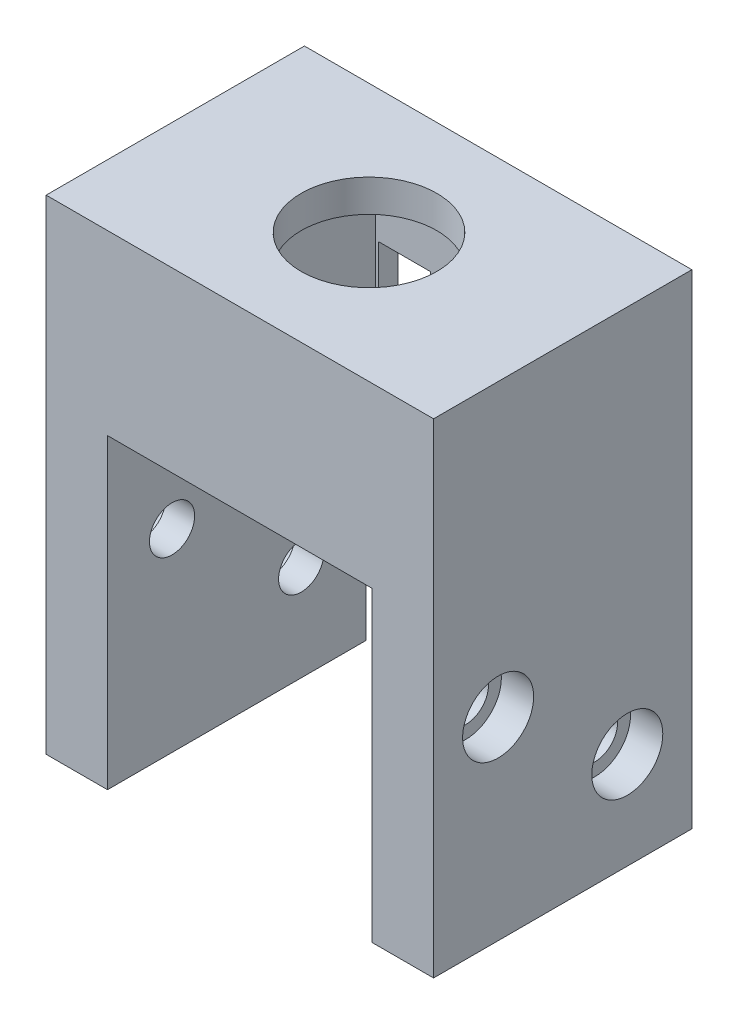
ISO-10303-21;
HEADER;
FILE_DESCRIPTION(('STEP AP214'),'2;1');
FILE_NAME('part.step','',(''),(''),'','','');
FILE_SCHEMA(('AUTOMOTIVE_DESIGN { 1 0 10303 214 1 1 1 1 }'));
ENDSEC;
DATA;
#1=APPLICATION_CONTEXT('core data for automotive mechanical design processes');
#2=APPLICATION_PROTOCOL_DEFINITION('international standard','automotive_design',2000,#1);
#3=PRODUCT_CONTEXT('',#1,'mechanical');
#4=PRODUCT('Part','Part','',(#3));
#5=PRODUCT_RELATED_PRODUCT_CATEGORY('part','',(#4));
#6=PRODUCT_DEFINITION_FORMATION('','',#4);
#7=PRODUCT_DEFINITION_CONTEXT('part definition',#1,'design');
#8=PRODUCT_DEFINITION('design','',#6,#7);
#9=PRODUCT_DEFINITION_SHAPE('','',#8);
#10=(LENGTH_UNIT() NAMED_UNIT(*) SI_UNIT(.MILLI.,.METRE.));
#11=(NAMED_UNIT(*) PLANE_ANGLE_UNIT() SI_UNIT($,.RADIAN.));
#12=(NAMED_UNIT(*) SI_UNIT($,.STERADIAN.) SOLID_ANGLE_UNIT());
#13=UNCERTAINTY_MEASURE_WITH_UNIT(LENGTH_MEASURE(1.E-05),#10,'distance_accuracy_value','');
#14=(GEOMETRIC_REPRESENTATION_CONTEXT(3) GLOBAL_UNCERTAINTY_ASSIGNED_CONTEXT((#13)) GLOBAL_UNIT_ASSIGNED_CONTEXT((#10,
#11,#12)) REPRESENTATION_CONTEXT('',''));
#15=CARTESIAN_POINT('',(0.,0.,0.));
#16=DIRECTION('',(0.,0.,1.));
#17=DIRECTION('',(1.,0.,0.));
#18=AXIS2_PLACEMENT_3D('',#15,#16,#17);
#19=CARTESIAN_POINT('',(-6.,-11.,-2.));
#20=DIRECTION('',(1.,0.,0.));
#21=DIRECTION('',(0.,0.,-1.));
#22=AXIS2_PLACEMENT_3D('',#19,#20,#21);
#23=CYLINDRICAL_SURFACE('',#22,0.699999999999999);
#24=CARTESIAN_POINT('',(4.1,-11.,-2.));
#25=DIRECTION('',(-1.,0.,0.));
#26=DIRECTION('',(0.,0.,1.));
#27=AXIS2_PLACEMENT_3D('',#24,#25,#26);
#28=CIRCLE('',#27,0.699999999999999);
#29=CARTESIAN_POINT('',(4.1,-11.,-1.3));
#30=VERTEX_POINT('',#29);
#31=EDGE_CURVE('E269',#30,#30,#28,.T.);
#32=ORIENTED_EDGE('',*,*,#31,.T.);
#33=EDGE_LOOP('',(#32));
#34=FACE_BOUND('',#33,.T.);
#35=CARTESIAN_POINT('',(5.,-11.,-2.));
#36=DIRECTION('',(1.,0.,0.));
#37=DIRECTION('',(0.,0.,-1.));
#38=AXIS2_PLACEMENT_3D('',#35,#36,#37);
#39=CIRCLE('',#38,0.699999999999999);
#40=CARTESIAN_POINT('',(5.,-11.,-2.7));
#41=VERTEX_POINT('',#40);
#42=EDGE_CURVE('E266',#41,#41,#39,.F.);
#43=ORIENTED_EDGE('',*,*,#42,.F.);
#44=EDGE_LOOP('',(#43));
#45=FACE_BOUND('',#44,.T.);
#46=ADVANCED_FACE('F54',(#34,#45),#23,.F.);
#47=CARTESIAN_POINT('',(-6.,-8.,2.));
#48=DIRECTION('',(1.,0.,0.));
#49=DIRECTION('',(0.,0.,-1.));
#50=AXIS2_PLACEMENT_3D('',#47,#48,#49);
#51=CYLINDRICAL_SURFACE('',#50,0.7);
#52=CARTESIAN_POINT('',(4.1,-8.,2.));
#53=DIRECTION('',(-1.,0.,0.));
#54=DIRECTION('',(0.,0.,1.));
#55=AXIS2_PLACEMENT_3D('',#52,#53,#54);
#56=CIRCLE('',#55,0.7);
#57=CARTESIAN_POINT('',(4.1,-8.,2.7));
#58=VERTEX_POINT('',#57);
#59=EDGE_CURVE('E306',#58,#58,#56,.T.);
#60=ORIENTED_EDGE('',*,*,#59,.T.);
#61=EDGE_LOOP('',(#60));
#62=FACE_BOUND('',#61,.T.);
#63=CARTESIAN_POINT('',(5.,-8.,2.));
#64=DIRECTION('',(1.,0.,0.));
#65=DIRECTION('',(0.,0.,-1.));
#66=AXIS2_PLACEMENT_3D('',#63,#64,#65);
#67=CIRCLE('',#66,0.7);
#68=CARTESIAN_POINT('',(5.,-8.,1.3));
#69=VERTEX_POINT('',#68);
#70=EDGE_CURVE('E263',#69,#69,#67,.F.);
#71=ORIENTED_EDGE('',*,*,#70,.F.);
#72=EDGE_LOOP('',(#71));
#73=FACE_BOUND('',#72,.T.);
#74=ADVANCED_FACE('F465',(#62,#73),#51,.F.);
#75=CARTESIAN_POINT('',(-4.1,1.,-4.));
#76=DIRECTION('',(0.,0.,-1.));
#77=DIRECTION('',(-1.,0.,0.));
#78=AXIS2_PLACEMENT_3D('',#75,#76,#77);
#79=PLANE('',#78);
#80=DIRECTION('',(1.,0.,0.));
#81=VECTOR('',#80,1.);
#82=CARTESIAN_POINT('',(0.,-4.5,-4.));
#83=LINE('',#82,#81);
#84=CARTESIAN_POINT('',(3.1,-4.5,-4.));
#85=VERTEX_POINT('',#84);
#86=CARTESIAN_POINT('',(4.1,-4.5,-4.));
#87=VERTEX_POINT('',#86);
#88=EDGE_CURVE('E217',#85,#87,#83,.T.);
#89=ORIENTED_EDGE('',*,*,#88,.F.);
#90=DIRECTION('',(0.,1.,0.));
#91=VECTOR('',#90,1.);
#92=CARTESIAN_POINT('',(3.1,0.,-4.));
#93=LINE('',#92,#91);
#94=CARTESIAN_POINT('',(3.1,-2.5,-4.));
#95=VERTEX_POINT('',#94);
#96=EDGE_CURVE('E200',#85,#95,#93,.T.);
#97=ORIENTED_EDGE('',*,*,#96,.T.);
#98=DIRECTION('',(-1.,0.,0.));
#99=VECTOR('',#98,1.);
#100=CARTESIAN_POINT('',(0.,-2.5,-4.));
#101=LINE('',#100,#99);
#102=CARTESIAN_POINT('',(1.5,-2.5,-4.));
#103=VERTEX_POINT('',#102);
#104=EDGE_CURVE('E210',#95,#103,#101,.T.);
#105=ORIENTED_EDGE('',*,*,#104,.T.);
#106=DIRECTION('',(0.,1.,0.));
#107=VECTOR('',#106,1.);
#108=CARTESIAN_POINT('',(1.5,0.,-4.));
#109=LINE('',#108,#107);
#110=CARTESIAN_POINT('',(1.5,-4.5,-4.));
#111=VERTEX_POINT('',#110);
#112=EDGE_CURVE('E193',#111,#103,#109,.T.);
#113=ORIENTED_EDGE('',*,*,#112,.F.);
#114=CARTESIAN_POINT('',(-1.5,-4.5,-4.));
#115=VERTEX_POINT('',#114);
#116=EDGE_CURVE('E207',#115,#111,#83,.T.);
#117=ORIENTED_EDGE('',*,*,#116,.F.);
#118=DIRECTION('',(0.,1.,0.));
#119=VECTOR('',#118,1.);
#120=CARTESIAN_POINT('',(-1.5,0.,-4.));
#121=LINE('',#120,#119);
#122=CARTESIAN_POINT('',(-1.5,-2.5,-4.));
#123=VERTEX_POINT('',#122);
#124=EDGE_CURVE('E339',#115,#123,#121,.T.);
#125=ORIENTED_EDGE('',*,*,#124,.T.);
#126=DIRECTION('',(-1.,0.,0.));
#127=VECTOR('',#126,1.);
#128=CARTESIAN_POINT('',(0.,-2.5,-4.));
#129=LINE('',#128,#127);
#130=CARTESIAN_POINT('',(-3.1,-2.5,-4.));
#131=VERTEX_POINT('',#130);
#132=EDGE_CURVE('E336',#123,#131,#129,.T.);
#133=ORIENTED_EDGE('',*,*,#132,.T.);
#134=DIRECTION('',(0.,1.,0.));
#135=VECTOR('',#134,1.);
#136=CARTESIAN_POINT('',(-3.1,0.,-4.));
#137=LINE('',#136,#135);
#138=CARTESIAN_POINT('',(-3.1,-4.5,-4.));
#139=VERTEX_POINT('',#138);
#140=EDGE_CURVE('E333',#139,#131,#137,.T.);
#141=ORIENTED_EDGE('',*,*,#140,.F.);
#142=CARTESIAN_POINT('',(-4.1,-4.5,-4.));
#143=VERTEX_POINT('',#142);
#144=EDGE_CURVE('E216',#143,#139,#83,.T.);
#145=ORIENTED_EDGE('',*,*,#144,.F.);
#146=DIRECTION('',(0.,1.,0.));
#147=VECTOR('',#146,1.);
#148=CARTESIAN_POINT('',(-4.1,-14.,-4.));
#149=LINE('',#148,#147);
#150=CARTESIAN_POINT('',(-4.1,-14.,-4.));
#151=VERTEX_POINT('',#150);
#152=EDGE_CURVE('E391',#151,#143,#149,.T.);
#153=ORIENTED_EDGE('',*,*,#152,.F.);
#154=DIRECTION('',(1.,0.,0.));
#155=VECTOR('',#154,1.);
#156=CARTESIAN_POINT('',(0.,-14.,-4.));
#157=LINE('',#156,#155);
#158=CARTESIAN_POINT('',(-6.,-14.,-4.));
#159=VERTEX_POINT('',#158);
#160=EDGE_CURVE('E379',#159,#151,#157,.T.);
#161=ORIENTED_EDGE('',*,*,#160,.F.);
#162=DIRECTION('',(0.,1.,0.));
#163=VECTOR('',#162,1.);
#164=CARTESIAN_POINT('',(-6.,-14.,-4.));
#165=LINE('',#164,#163);
#166=CARTESIAN_POINT('',(-6.,1.,-4.));
#167=VERTEX_POINT('',#166);
#168=EDGE_CURVE('E388',#159,#167,#165,.T.);
#169=ORIENTED_EDGE('',*,*,#168,.T.);
#170=DIRECTION('',(1.,0.,0.));
#171=VECTOR('',#170,1.);
#172=CARTESIAN_POINT('',(-4.1,1.,-4.));
#173=LINE('',#172,#171);
#174=CARTESIAN_POINT('',(6.,1.,-4.));
#175=VERTEX_POINT('',#174);
#176=EDGE_CURVE('E12',#167,#175,#173,.T.);
#177=ORIENTED_EDGE('',*,*,#176,.T.);
#178=DIRECTION('',(0.,1.,0.));
#179=VECTOR('',#178,1.);
#180=CARTESIAN_POINT('',(6.,-14.,-4.));
#181=LINE('',#180,#179);
#182=CARTESIAN_POINT('',(6.,-14.,-4.));
#183=VERTEX_POINT('',#182);
#184=EDGE_CURVE('E365',#183,#175,#181,.T.);
#185=ORIENTED_EDGE('',*,*,#184,.F.);
#186=DIRECTION('',(-1.,0.,0.));
#187=VECTOR('',#186,1.);
#188=CARTESIAN_POINT('',(0.,-14.,-4.));
#189=LINE('',#188,#187);
#190=CARTESIAN_POINT('',(4.1,-14.,-4.));
#191=VERTEX_POINT('',#190);
#192=EDGE_CURVE('E354',#183,#191,#189,.T.);
#193=ORIENTED_EDGE('',*,*,#192,.T.);
#194=DIRECTION('',(0.,1.,0.));
#195=VECTOR('',#194,1.);
#196=CARTESIAN_POINT('',(4.1,-14.,-4.));
#197=LINE('',#196,#195);
#198=EDGE_CURVE('E368',#191,#87,#197,.T.);
#199=ORIENTED_EDGE('',*,*,#198,.T.);
#200=EDGE_LOOP('',(#89,#97,#105,#113,#117,#125,#133,#141,#145,#153,#161,#169,#177,#185,#193,#199));
#201=FACE_BOUND('',#200,.T.);
#202=ADVANCED_FACE('F205',(#201),#79,.T.);
#203=CARTESIAN_POINT('',(0.,-4.5,-3.4));
#204=DIRECTION('',(0.,0.,-1.));
#205=DIRECTION('',(-1.,0.,0.));
#206=AXIS2_PLACEMENT_3D('',#203,#204,#205);
#207=PLANE('',#206);
#208=DIRECTION('',(0.,-1.,0.));
#209=VECTOR('',#208,1.);
#210=CARTESIAN_POINT('',(3.1,0.,-3.4));
#211=LINE('',#210,#209);
#212=CARTESIAN_POINT('',(3.1,-2.5,-3.4));
#213=VERTEX_POINT('',#212);
#214=CARTESIAN_POINT('',(3.1,-4.5,-3.4));
#215=VERTEX_POINT('',#214);
#216=EDGE_CURVE('E211',#213,#215,#211,.T.);
#217=ORIENTED_EDGE('',*,*,#216,.T.);
#218=DIRECTION('',(-1.,0.,0.));
#219=VECTOR('',#218,1.);
#220=CARTESIAN_POINT('',(0.,-4.5,-3.4));
#221=LINE('',#220,#219);
#222=CARTESIAN_POINT('',(3.2,-4.5,-3.4));
#223=VERTEX_POINT('',#222);
#224=EDGE_CURVE('E398',#223,#215,#221,.T.);
#225=ORIENTED_EDGE('',*,*,#224,.F.);
#226=DIRECTION('',(0.,1.,0.));
#227=VECTOR('',#226,1.);
#228=CARTESIAN_POINT('',(3.2,-4.5,-3.4));
#229=LINE('',#228,#227);
#230=CARTESIAN_POINT('',(3.2,0.,-3.4));
#231=VERTEX_POINT('',#230);
#232=EDGE_CURVE('E254',#223,#231,#229,.T.);
#233=ORIENTED_EDGE('',*,*,#232,.T.);
#234=DIRECTION('',(-1.,0.,0.));
#235=VECTOR('',#234,1.);
#236=CARTESIAN_POINT('',(0.,0.,-3.4));
#237=LINE('',#236,#235);
#238=CARTESIAN_POINT('',(-3.2,0.,-3.4));
#239=VERTEX_POINT('',#238);
#240=EDGE_CURVE('E237',#231,#239,#237,.T.);
#241=ORIENTED_EDGE('',*,*,#240,.T.);
#242=DIRECTION('',(0.,1.,0.));
#243=VECTOR('',#242,1.);
#244=CARTESIAN_POINT('',(-3.2,-4.5,-3.4));
#245=LINE('',#244,#243);
#246=CARTESIAN_POINT('',(-3.2,-4.5,-3.4));
#247=VERTEX_POINT('',#246);
#248=EDGE_CURVE('E252',#247,#239,#245,.T.);
#249=ORIENTED_EDGE('',*,*,#248,.F.);
#250=CARTESIAN_POINT('',(-3.1,-4.5,-3.4));
#251=VERTEX_POINT('',#250);
#252=EDGE_CURVE('E397',#251,#247,#221,.T.);
#253=ORIENTED_EDGE('',*,*,#252,.F.);
#254=DIRECTION('',(0.,-1.,0.));
#255=VECTOR('',#254,1.);
#256=CARTESIAN_POINT('',(-3.1,0.,-3.4));
#257=LINE('',#256,#255);
#258=CARTESIAN_POINT('',(-3.1,-2.5,-3.4));
#259=VERTEX_POINT('',#258);
#260=EDGE_CURVE('E71',#259,#251,#257,.T.);
#261=ORIENTED_EDGE('',*,*,#260,.F.);
#262=DIRECTION('',(1.,0.,0.));
#263=VECTOR('',#262,1.);
#264=CARTESIAN_POINT('',(0.,-2.5,-3.4));
#265=LINE('',#264,#263);
#266=CARTESIAN_POINT('',(-1.5,-2.5,-3.4));
#267=VERTEX_POINT('',#266);
#268=EDGE_CURVE('E312',#259,#267,#265,.T.);
#269=ORIENTED_EDGE('',*,*,#268,.T.);
#270=DIRECTION('',(0.,-1.,0.));
#271=VECTOR('',#270,1.);
#272=CARTESIAN_POINT('',(-1.5,0.,-3.4));
#273=LINE('',#272,#271);
#274=CARTESIAN_POINT('',(-1.5,-4.5,-3.4));
#275=VERTEX_POINT('',#274);
#276=EDGE_CURVE('E330',#267,#275,#273,.T.);
#277=ORIENTED_EDGE('',*,*,#276,.T.);
#278=CARTESIAN_POINT('',(1.5,-4.5,-3.4));
#279=VERTEX_POINT('',#278);
#280=EDGE_CURVE('E401',#279,#275,#221,.T.);
#281=ORIENTED_EDGE('',*,*,#280,.F.);
#282=DIRECTION('',(0.,-1.,0.));
#283=VECTOR('',#282,1.);
#284=CARTESIAN_POINT('',(1.5,0.,-3.4));
#285=LINE('',#284,#283);
#286=CARTESIAN_POINT('',(1.5,-2.5,-3.4));
#287=VERTEX_POINT('',#286);
#288=EDGE_CURVE('E79',#287,#279,#285,.T.);
#289=ORIENTED_EDGE('',*,*,#288,.F.);
#290=DIRECTION('',(1.,0.,0.));
#291=VECTOR('',#290,1.);
#292=CARTESIAN_POINT('',(0.,-2.5,-3.4));
#293=LINE('',#292,#291);
#294=EDGE_CURVE('E313',#287,#213,#293,.T.);
#295=ORIENTED_EDGE('',*,*,#294,.T.);
#296=EDGE_LOOP('',(#217,#225,#233,#241,#249,#253,#261,#269,#277,#281,#289,#295));
#297=FACE_BOUND('',#296,.T.);
#298=ADVANCED_FACE('F417',(#297),#207,.F.);
#299=CARTESIAN_POINT('',(0.,-4.5,0.));
#300=DIRECTION('',(0.,-1.,0.));
#301=DIRECTION('',(0.,0.,-1.));
#302=AXIS2_PLACEMENT_3D('',#299,#300,#301);
#303=PLANE('',#302);
#304=ORIENTED_EDGE('',*,*,#224,.T.);
#305=DIRECTION('',(0.,0.,-1.));
#306=VECTOR('',#305,1.);
#307=CARTESIAN_POINT('',(3.1,-4.5,4.001));
#308=LINE('',#307,#306);
#309=EDGE_CURVE('E320',#215,#85,#308,.T.);
#310=ORIENTED_EDGE('',*,*,#309,.T.);
#311=ORIENTED_EDGE('',*,*,#88,.T.);
#312=DIRECTION('',(0.,0.,1.));
#313=VECTOR('',#312,1.);
#314=CARTESIAN_POINT('',(4.1,-4.5,0.));
#315=LINE('',#314,#313);
#316=CARTESIAN_POINT('',(4.1,-4.5,4.));
#317=VERTEX_POINT('',#316);
#318=EDGE_CURVE('E220',#87,#317,#315,.T.);
#319=ORIENTED_EDGE('',*,*,#318,.T.);
#320=DIRECTION('',(-1.,0.,0.));
#321=VECTOR('',#320,1.);
#322=CARTESIAN_POINT('',(0.,-4.5,4.));
#323=LINE('',#322,#321);
#324=CARTESIAN_POINT('',(-4.1,-4.5,4.));
#325=VERTEX_POINT('',#324);
#326=EDGE_CURVE('E227',#317,#325,#323,.T.);
#327=ORIENTED_EDGE('',*,*,#326,.T.);
#328=DIRECTION('',(0.,0.,-1.));
#329=VECTOR('',#328,1.);
#330=CARTESIAN_POINT('',(-4.1,-4.5,0.));
#331=LINE('',#330,#329);
#332=EDGE_CURVE('E230',#325,#143,#331,.T.);
#333=ORIENTED_EDGE('',*,*,#332,.T.);
#334=ORIENTED_EDGE('',*,*,#144,.T.);
#335=DIRECTION('',(0.,0.,-1.));
#336=VECTOR('',#335,1.);
#337=CARTESIAN_POINT('',(-3.1,-4.5,4.001));
#338=LINE('',#337,#336);
#339=EDGE_CURVE('E341',#251,#139,#338,.T.);
#340=ORIENTED_EDGE('',*,*,#339,.F.);
#341=ORIENTED_EDGE('',*,*,#252,.T.);
#342=DIRECTION('',(0.,0.,-1.));
#343=VECTOR('',#342,1.);
#344=CARTESIAN_POINT('',(-3.2,-4.5,0.));
#345=LINE('',#344,#343);
#346=CARTESIAN_POINT('',(-3.2,-4.5,3.4));
#347=VERTEX_POINT('',#346);
#348=EDGE_CURVE('E400',#347,#247,#345,.T.);
#349=ORIENTED_EDGE('',*,*,#348,.F.);
#350=DIRECTION('',(-1.,0.,0.));
#351=VECTOR('',#350,1.);
#352=CARTESIAN_POINT('',(0.,-4.5,3.4));
#353=LINE('',#352,#351);
#354=CARTESIAN_POINT('',(3.2,-4.5,3.4));
#355=VERTEX_POINT('',#354);
#356=EDGE_CURVE('E221',#355,#347,#353,.T.);
#357=ORIENTED_EDGE('',*,*,#356,.F.);
#358=DIRECTION('',(0.,0.,-1.));
#359=VECTOR('',#358,1.);
#360=CARTESIAN_POINT('',(3.2,-4.5,0.));
#361=LINE('',#360,#359);
#362=EDGE_CURVE('E247',#355,#223,#361,.T.);
#363=ORIENTED_EDGE('',*,*,#362,.T.);
#364=EDGE_LOOP('',(#304,#310,#311,#319,#327,#333,#334,#340,#341,#349,#357,#363));
#365=FACE_BOUND('',#364,.T.);
#366=ADVANCED_FACE('F412',(#365),#303,.T.);
#367=DIRECTION('',(0.,0.,-1.));
#368=VECTOR('',#367,1.);
#369=CARTESIAN_POINT('',(1.5,-4.5,4.001));
#370=LINE('',#369,#368);
#371=EDGE_CURVE('E190',#279,#111,#370,.T.);
#372=ORIENTED_EDGE('',*,*,#371,.F.);
#373=ORIENTED_EDGE('',*,*,#280,.T.);
#374=DIRECTION('',(0.,0.,-1.));
#375=VECTOR('',#374,1.);
#376=CARTESIAN_POINT('',(-1.5,-4.5,4.001));
#377=LINE('',#376,#375);
#378=EDGE_CURVE('E215',#275,#115,#377,.T.);
#379=ORIENTED_EDGE('',*,*,#378,.T.);
#380=ORIENTED_EDGE('',*,*,#116,.T.);
#381=EDGE_LOOP('',(#372,#373,#379,#380));
#382=FACE_BOUND('',#381,.T.);
#383=ADVANCED_FACE('F214',(#382),#303,.T.);
#384=CARTESIAN_POINT('',(0.,0.,0.));
#385=DIRECTION('',(0.,1.,0.));
#386=DIRECTION('',(0.,0.,1.));
#387=AXIS2_PLACEMENT_3D('',#384,#385,#386);
#388=PLANE('',#387);
#389=CARTESIAN_POINT('',(0.,0.,0.));
#390=DIRECTION('',(0.,1.,0.));
#391=DIRECTION('',(0.,0.,1.));
#392=AXIS2_PLACEMENT_3D('',#389,#390,#391);
#393=CIRCLE('',#392,2.1);
#394=CARTESIAN_POINT('',(0.,0.,2.1));
#395=VERTEX_POINT('',#394);
#396=EDGE_CURVE('E256',#395,#395,#393,.T.);
#397=ORIENTED_EDGE('',*,*,#396,.T.);
#398=EDGE_LOOP('',(#397));
#399=FACE_BOUND('',#398,.T.);
#400=DIRECTION('',(0.,0.,-1.));
#401=VECTOR('',#400,1.);
#402=CARTESIAN_POINT('',(3.2,0.,0.));
#403=LINE('',#402,#401);
#404=CARTESIAN_POINT('',(3.2,0.,3.4));
#405=VERTEX_POINT('',#404);
#406=EDGE_CURVE('E234',#405,#231,#403,.T.);
#407=ORIENTED_EDGE('',*,*,#406,.F.);
#408=DIRECTION('',(-1.,0.,0.));
#409=VECTOR('',#408,1.);
#410=CARTESIAN_POINT('',(0.,0.,3.4));
#411=LINE('',#410,#409);
#412=CARTESIAN_POINT('',(-3.2,0.,3.4));
#413=VERTEX_POINT('',#412);
#414=EDGE_CURVE('E244',#405,#413,#411,.T.);
#415=ORIENTED_EDGE('',*,*,#414,.T.);
#416=DIRECTION('',(0.,0.,-1.));
#417=VECTOR('',#416,1.);
#418=CARTESIAN_POINT('',(-3.2,0.,0.));
#419=LINE('',#418,#417);
#420=EDGE_CURVE('E241',#413,#239,#419,.T.);
#421=ORIENTED_EDGE('',*,*,#420,.T.);
#422=ORIENTED_EDGE('',*,*,#240,.F.);
#423=EDGE_LOOP('',(#407,#415,#421,#422));
#424=FACE_BOUND('',#423,.T.);
#425=ADVANCED_FACE('F422',(#399,#424),#388,.F.);
#426=CARTESIAN_POINT('',(0.,1.,0.));
#427=DIRECTION('',(0.,1.,0.));
#428=DIRECTION('',(0.,0.,1.));
#429=AXIS2_PLACEMENT_3D('',#426,#427,#428);
#430=PLANE('',#429);
#431=DIRECTION('',(1.,0.,0.));
#432=VECTOR('',#431,1.);
#433=CARTESIAN_POINT('',(-4.1,1.,4.));
#434=LINE('',#433,#432);
#435=CARTESIAN_POINT('',(-6.,1.,4.));
#436=VERTEX_POINT('',#435);
#437=CARTESIAN_POINT('',(6.,1.,4.));
#438=VERTEX_POINT('',#437);
#439=EDGE_CURVE('E63',#436,#438,#434,.T.);
#440=ORIENTED_EDGE('',*,*,#439,.T.);
#441=DIRECTION('',(0.,0.,-1.));
#442=VECTOR('',#441,1.);
#443=CARTESIAN_POINT('',(6.,1.,0.));
#444=LINE('',#443,#442);
#445=EDGE_CURVE('E327',#438,#175,#444,.T.);
#446=ORIENTED_EDGE('',*,*,#445,.T.);
#447=ORIENTED_EDGE('',*,*,#176,.F.);
#448=DIRECTION('',(0.,0.,-1.));
#449=VECTOR('',#448,1.);
#450=CARTESIAN_POINT('',(-6.,1.,0.));
#451=LINE('',#450,#449);
#452=EDGE_CURVE('E373',#436,#167,#451,.T.);
#453=ORIENTED_EDGE('',*,*,#452,.F.);
#454=EDGE_LOOP('',(#440,#446,#447,#453));
#455=FACE_BOUND('',#454,.T.);
#456=CARTESIAN_POINT('',(0.,1.,0.));
#457=DIRECTION('',(0.,1.,0.));
#458=DIRECTION('',(0.,0.,1.));
#459=AXIS2_PLACEMENT_3D('',#456,#457,#458);
#460=CIRCLE('',#459,2.1);
#461=CARTESIAN_POINT('',(0.,1.,2.1));
#462=VERTEX_POINT('',#461);
#463=EDGE_CURVE('E257',#462,#462,#460,.T.);
#464=ORIENTED_EDGE('',*,*,#463,.F.);
#465=EDGE_LOOP('',(#464));
#466=FACE_BOUND('',#465,.T.);
#467=ADVANCED_FACE('F518',(#455,#466),#430,.T.);
#468=CARTESIAN_POINT('',(-4.1,1.,4.));
#469=DIRECTION('',(0.,0.,-1.));
#470=DIRECTION('',(-1.,0.,0.));
#471=AXIS2_PLACEMENT_3D('',#468,#469,#470);
#472=PLANE('',#471);
#473=ORIENTED_EDGE('',*,*,#439,.F.);
#474=DIRECTION('',(0.,1.,0.));
#475=VECTOR('',#474,1.);
#476=CARTESIAN_POINT('',(-6.,-14.,4.));
#477=LINE('',#476,#475);
#478=CARTESIAN_POINT('',(-6.,-14.,4.));
#479=VERTEX_POINT('',#478);
#480=EDGE_CURVE('E238',#479,#436,#477,.T.);
#481=ORIENTED_EDGE('',*,*,#480,.F.);
#482=DIRECTION('',(1.,0.,0.));
#483=VECTOR('',#482,1.);
#484=CARTESIAN_POINT('',(0.,-14.,4.));
#485=LINE('',#484,#483);
#486=CARTESIAN_POINT('',(-4.1,-14.,4.));
#487=VERTEX_POINT('',#486);
#488=EDGE_CURVE('E374',#479,#487,#485,.T.);
#489=ORIENTED_EDGE('',*,*,#488,.T.);
#490=DIRECTION('',(0.,1.,0.));
#491=VECTOR('',#490,1.);
#492=CARTESIAN_POINT('',(-4.1,-14.,4.));
#493=LINE('',#492,#491);
#494=EDGE_CURVE('E383',#487,#325,#493,.T.);
#495=ORIENTED_EDGE('',*,*,#494,.T.);
#496=ORIENTED_EDGE('',*,*,#326,.F.);
#497=DIRECTION('',(0.,1.,0.));
#498=VECTOR('',#497,1.);
#499=CARTESIAN_POINT('',(4.1,-14.,4.));
#500=LINE('',#499,#498);
#501=CARTESIAN_POINT('',(4.1,-14.,4.));
#502=VERTEX_POINT('',#501);
#503=EDGE_CURVE('E371',#502,#317,#500,.T.);
#504=ORIENTED_EDGE('',*,*,#503,.F.);
#505=DIRECTION('',(-1.,0.,0.));
#506=VECTOR('',#505,1.);
#507=CARTESIAN_POINT('',(0.,-14.,4.));
#508=LINE('',#507,#506);
#509=CARTESIAN_POINT('',(6.,-14.,4.));
#510=VERTEX_POINT('',#509);
#511=EDGE_CURVE('E349',#510,#502,#508,.T.);
#512=ORIENTED_EDGE('',*,*,#511,.F.);
#513=DIRECTION('',(0.,1.,0.));
#514=VECTOR('',#513,1.);
#515=CARTESIAN_POINT('',(6.,-14.,4.));
#516=LINE('',#515,#514);
#517=EDGE_CURVE('E360',#510,#438,#516,.T.);
#518=ORIENTED_EDGE('',*,*,#517,.T.);
#519=EDGE_LOOP('',(#473,#481,#489,#495,#496,#504,#512,#518));
#520=FACE_BOUND('',#519,.T.);
#521=ADVANCED_FACE('F56',(#520),#472,.F.);
#522=CARTESIAN_POINT('',(0.,1.,0.));
#523=DIRECTION('',(0.,-1.,0.));
#524=DIRECTION('',(0.,0.,-1.));
#525=AXIS2_PLACEMENT_3D('',#522,#523,#524);
#526=CYLINDRICAL_SURFACE('',#525,2.1);
#527=ORIENTED_EDGE('',*,*,#463,.T.);
#528=EDGE_LOOP('',(#527));
#529=FACE_BOUND('',#528,.T.);
#530=ORIENTED_EDGE('',*,*,#396,.F.);
#531=EDGE_LOOP('',(#530));
#532=FACE_BOUND('',#531,.T.);
#533=ADVANCED_FACE('F514',(#529,#532),#526,.F.);
#534=CARTESIAN_POINT('',(3.2,-4.5,0.));
#535=DIRECTION('',(1.,0.,0.));
#536=DIRECTION('',(0.,0.,-1.));
#537=AXIS2_PLACEMENT_3D('',#534,#535,#536);
#538=PLANE('',#537);
#539=ORIENTED_EDGE('',*,*,#406,.T.);
#540=ORIENTED_EDGE('',*,*,#232,.F.);
#541=ORIENTED_EDGE('',*,*,#362,.F.);
#542=DIRECTION('',(0.,1.,0.));
#543=VECTOR('',#542,1.);
#544=CARTESIAN_POINT('',(3.2,-4.5,3.4));
#545=LINE('',#544,#543);
#546=EDGE_CURVE('E233',#355,#405,#545,.T.);
#547=ORIENTED_EDGE('',*,*,#546,.T.);
#548=EDGE_LOOP('',(#539,#540,#541,#547));
#549=FACE_BOUND('',#548,.T.);
#550=ADVANCED_FACE('F424',(#549),#538,.F.);
#551=CARTESIAN_POINT('',(-3.2,-4.5,0.));
#552=DIRECTION('',(1.,0.,0.));
#553=DIRECTION('',(0.,0.,-1.));
#554=AXIS2_PLACEMENT_3D('',#551,#552,#553);
#555=PLANE('',#554);
#556=ORIENTED_EDGE('',*,*,#420,.F.);
#557=DIRECTION('',(0.,1.,0.));
#558=VECTOR('',#557,1.);
#559=CARTESIAN_POINT('',(-3.2,-4.5,3.4));
#560=LINE('',#559,#558);
#561=EDGE_CURVE('E249',#347,#413,#560,.T.);
#562=ORIENTED_EDGE('',*,*,#561,.F.);
#563=ORIENTED_EDGE('',*,*,#348,.T.);
#564=ORIENTED_EDGE('',*,*,#248,.T.);
#565=EDGE_LOOP('',(#556,#562,#563,#564));
#566=FACE_BOUND('',#565,.T.);
#567=ADVANCED_FACE('F419',(#566),#555,.T.);
#568=CARTESIAN_POINT('',(0.,-4.5,3.4));
#569=DIRECTION('',(0.,0.,-1.));
#570=DIRECTION('',(-1.,0.,0.));
#571=AXIS2_PLACEMENT_3D('',#568,#569,#570);
#572=PLANE('',#571);
#573=ORIENTED_EDGE('',*,*,#414,.F.);
#574=ORIENTED_EDGE('',*,*,#546,.F.);
#575=ORIENTED_EDGE('',*,*,#356,.T.);
#576=ORIENTED_EDGE('',*,*,#561,.T.);
#577=EDGE_LOOP('',(#573,#574,#575,#576));
#578=FACE_BOUND('',#577,.T.);
#579=ADVANCED_FACE('F409',(#578),#572,.T.);
#580=CARTESIAN_POINT('',(-6.,-14.,0.));
#581=DIRECTION('',(1.,0.,0.));
#582=DIRECTION('',(0.,0.,-1.));
#583=AXIS2_PLACEMENT_3D('',#580,#581,#582);
#584=PLANE('',#583);
#585=CARTESIAN_POINT('',(-6.,-8.,2.));
#586=DIRECTION('',(1.,0.,0.));
#587=DIRECTION('',(0.,0.,-1.));
#588=AXIS2_PLACEMENT_3D('',#585,#586,#587);
#589=CIRCLE('',#588,1.1);
#590=CARTESIAN_POINT('',(-6.,-8.,0.899999999999996));
#591=VERTEX_POINT('',#590);
#592=EDGE_CURVE('E278',#591,#591,#589,.T.);
#593=ORIENTED_EDGE('',*,*,#592,.T.);
#594=EDGE_LOOP('',(#593));
#595=FACE_BOUND('',#594,.T.);
#596=CARTESIAN_POINT('',(-6.,-11.,-2.));
#597=DIRECTION('',(1.,0.,0.));
#598=DIRECTION('',(0.,0.,-1.));
#599=AXIS2_PLACEMENT_3D('',#596,#597,#598);
#600=CIRCLE('',#599,1.1);
#601=CARTESIAN_POINT('',(-6.,-11.,-3.1));
#602=VERTEX_POINT('',#601);
#603=EDGE_CURVE('E283',#602,#602,#600,.T.);
#604=ORIENTED_EDGE('',*,*,#603,.T.);
#605=EDGE_LOOP('',(#604));
#606=FACE_BOUND('',#605,.T.);
#607=ORIENTED_EDGE('',*,*,#452,.T.);
#608=ORIENTED_EDGE('',*,*,#168,.F.);
#609=DIRECTION('',(0.,0.,-1.));
#610=VECTOR('',#609,1.);
#611=CARTESIAN_POINT('',(-6.,-14.,0.));
#612=LINE('',#611,#610);
#613=EDGE_CURVE('E381',#479,#159,#612,.T.);
#614=ORIENTED_EDGE('',*,*,#613,.F.);
#615=ORIENTED_EDGE('',*,*,#480,.T.);
#616=EDGE_LOOP('',(#607,#608,#614,#615));
#617=FACE_BOUND('',#616,.T.);
#618=ADVANCED_FACE('F492',(#595,#606,#617),#584,.F.);
#619=CARTESIAN_POINT('',(-4.1,-14.,0.));
#620=DIRECTION('',(-1.,0.,0.));
#621=DIRECTION('',(0.,0.,1.));
#622=AXIS2_PLACEMENT_3D('',#619,#620,#621);
#623=PLANE('',#622);
#624=CARTESIAN_POINT('',(-4.1,-8.,2.));
#625=DIRECTION('',(-1.,0.,0.));
#626=DIRECTION('',(0.,0.,1.));
#627=AXIS2_PLACEMENT_3D('',#624,#625,#626);
#628=CIRCLE('',#627,0.7);
#629=CARTESIAN_POINT('',(-4.1,-8.,2.7));
#630=VERTEX_POINT('',#629);
#631=EDGE_CURVE('E309',#630,#630,#628,.T.);
#632=ORIENTED_EDGE('',*,*,#631,.T.);
#633=EDGE_LOOP('',(#632));
#634=FACE_BOUND('',#633,.T.);
#635=CARTESIAN_POINT('',(-4.1,-11.,-2.));
#636=DIRECTION('',(-1.,0.,0.));
#637=DIRECTION('',(0.,0.,1.));
#638=AXIS2_PLACEMENT_3D('',#635,#636,#637);
#639=CIRCLE('',#638,0.699999999999999);
#640=CARTESIAN_POINT('',(-4.1,-11.,-1.3));
#641=VERTEX_POINT('',#640);
#642=EDGE_CURVE('E303',#641,#641,#639,.T.);
#643=ORIENTED_EDGE('',*,*,#642,.T.);
#644=EDGE_LOOP('',(#643));
#645=FACE_BOUND('',#644,.T.);
#646=ORIENTED_EDGE('',*,*,#332,.F.);
#647=ORIENTED_EDGE('',*,*,#494,.F.);
#648=DIRECTION('',(0.,0.,1.));
#649=VECTOR('',#648,1.);
#650=CARTESIAN_POINT('',(-4.1,-14.,0.));
#651=LINE('',#650,#649);
#652=EDGE_CURVE('E377',#151,#487,#651,.T.);
#653=ORIENTED_EDGE('',*,*,#652,.F.);
#654=ORIENTED_EDGE('',*,*,#152,.T.);
#655=EDGE_LOOP('',(#646,#647,#653,#654));
#656=FACE_BOUND('',#655,.T.);
#657=ADVANCED_FACE('F489',(#634,#645,#656),#623,.F.);
#658=CARTESIAN_POINT('',(0.,-14.,0.));
#659=DIRECTION('',(0.,-1.,0.));
#660=DIRECTION('',(0.,0.,-1.));
#661=AXIS2_PLACEMENT_3D('',#658,#659,#660);
#662=PLANE('',#661);
#663=ORIENTED_EDGE('',*,*,#488,.F.);
#664=ORIENTED_EDGE('',*,*,#613,.T.);
#665=ORIENTED_EDGE('',*,*,#160,.T.);
#666=ORIENTED_EDGE('',*,*,#652,.T.);
#667=EDGE_LOOP('',(#663,#664,#665,#666));
#668=FACE_BOUND('',#667,.T.);
#669=ADVANCED_FACE('F491',(#668),#662,.T.);
#670=CARTESIAN_POINT('',(4.1,-14.,0.));
#671=DIRECTION('',(-1.,0.,0.));
#672=DIRECTION('',(0.,0.,1.));
#673=AXIS2_PLACEMENT_3D('',#670,#671,#672);
#674=PLANE('',#673);
#675=ORIENTED_EDGE('',*,*,#59,.F.);
#676=EDGE_LOOP('',(#675));
#677=FACE_BOUND('',#676,.T.);
#678=ORIENTED_EDGE('',*,*,#31,.F.);
#679=EDGE_LOOP('',(#678));
#680=FACE_BOUND('',#679,.T.);
#681=ORIENTED_EDGE('',*,*,#318,.F.);
#682=ORIENTED_EDGE('',*,*,#198,.F.);
#683=DIRECTION('',(0.,0.,1.));
#684=VECTOR('',#683,1.);
#685=CARTESIAN_POINT('',(4.1,-14.,0.));
#686=LINE('',#685,#684);
#687=EDGE_CURVE('E351',#191,#502,#686,.T.);
#688=ORIENTED_EDGE('',*,*,#687,.T.);
#689=ORIENTED_EDGE('',*,*,#503,.T.);
#690=EDGE_LOOP('',(#681,#682,#688,#689));
#691=FACE_BOUND('',#690,.T.);
#692=ADVANCED_FACE('F431',(#677,#680,#691),#674,.T.);
#693=CARTESIAN_POINT('',(6.,-14.,0.));
#694=DIRECTION('',(1.,0.,0.));
#695=DIRECTION('',(0.,0.,-1.));
#696=AXIS2_PLACEMENT_3D('',#693,#694,#695);
#697=PLANE('',#696);
#698=CARTESIAN_POINT('',(6.,-8.,2.));
#699=DIRECTION('',(1.,0.,0.));
#700=DIRECTION('',(0.,0.,-1.));
#701=AXIS2_PLACEMENT_3D('',#698,#699,#700);
#702=CIRCLE('',#701,1.1);
#703=CARTESIAN_POINT('',(6.,-8.,0.899999999999999));
#704=VERTEX_POINT('',#703);
#705=EDGE_CURVE('E293',#704,#704,#702,.T.);
#706=ORIENTED_EDGE('',*,*,#705,.F.);
#707=EDGE_LOOP('',(#706));
#708=FACE_BOUND('',#707,.T.);
#709=CARTESIAN_POINT('',(6.,-11.,-2.));
#710=DIRECTION('',(1.,0.,0.));
#711=DIRECTION('',(0.,0.,-1.));
#712=AXIS2_PLACEMENT_3D('',#709,#710,#711);
#713=CIRCLE('',#712,1.1);
#714=CARTESIAN_POINT('',(6.,-11.,-3.1));
#715=VERTEX_POINT('',#714);
#716=EDGE_CURVE('E296',#715,#715,#713,.T.);
#717=ORIENTED_EDGE('',*,*,#716,.F.);
#718=EDGE_LOOP('',(#717));
#719=FACE_BOUND('',#718,.T.);
#720=ORIENTED_EDGE('',*,*,#445,.F.);
#721=ORIENTED_EDGE('',*,*,#517,.F.);
#722=DIRECTION('',(0.,0.,-1.));
#723=VECTOR('',#722,1.);
#724=CARTESIAN_POINT('',(6.,-14.,0.));
#725=LINE('',#724,#723);
#726=EDGE_CURVE('E357',#510,#183,#725,.T.);
#727=ORIENTED_EDGE('',*,*,#726,.T.);
#728=ORIENTED_EDGE('',*,*,#184,.T.);
#729=EDGE_LOOP('',(#720,#721,#727,#728));
#730=FACE_BOUND('',#729,.T.);
#731=ADVANCED_FACE('F461',(#708,#719,#730),#697,.T.);
#732=CARTESIAN_POINT('',(0.,-14.,0.));
#733=DIRECTION('',(0.,1.,0.));
#734=DIRECTION('',(0.,0.,1.));
#735=AXIS2_PLACEMENT_3D('',#732,#733,#734);
#736=PLANE('',#735);
#737=ORIENTED_EDGE('',*,*,#511,.T.);
#738=ORIENTED_EDGE('',*,*,#687,.F.);
#739=ORIENTED_EDGE('',*,*,#192,.F.);
#740=ORIENTED_EDGE('',*,*,#726,.F.);
#741=EDGE_LOOP('',(#737,#738,#739,#740));
#742=FACE_BOUND('',#741,.T.);
#743=ADVANCED_FACE('F433',(#742),#736,.F.);
#744=CARTESIAN_POINT('',(-1.5,0.,4.001));
#745=DIRECTION('',(-1.,0.,0.));
#746=DIRECTION('',(0.,-1.,0.));
#747=AXIS2_PLACEMENT_3D('',#744,#745,#746);
#748=PLANE('',#747);
#749=DIRECTION('',(0.,0.,-1.));
#750=VECTOR('',#749,1.);
#751=CARTESIAN_POINT('',(-1.5,-2.5,4.001));
#752=LINE('',#751,#750);
#753=EDGE_CURVE('E343',#267,#123,#752,.T.);
#754=ORIENTED_EDGE('',*,*,#753,.T.);
#755=ORIENTED_EDGE('',*,*,#124,.F.);
#756=ORIENTED_EDGE('',*,*,#378,.F.);
#757=ORIENTED_EDGE('',*,*,#276,.F.);
#758=EDGE_LOOP('',(#754,#755,#756,#757));
#759=FACE_BOUND('',#758,.T.);
#760=ADVANCED_FACE('F453',(#759),#748,.T.);
#761=CARTESIAN_POINT('',(0.,-2.5,4.001));
#762=DIRECTION('',(0.,-1.,0.));
#763=DIRECTION('',(0.,0.,-1.));
#764=AXIS2_PLACEMENT_3D('',#761,#762,#763);
#765=PLANE('',#764);
#766=DIRECTION('',(0.,0.,-1.));
#767=VECTOR('',#766,1.);
#768=CARTESIAN_POINT('',(-3.1,-2.5,4.001));
#769=LINE('',#768,#767);
#770=EDGE_CURVE('E345',#259,#131,#769,.T.);
#771=ORIENTED_EDGE('',*,*,#770,.T.);
#772=ORIENTED_EDGE('',*,*,#132,.F.);
#773=ORIENTED_EDGE('',*,*,#753,.F.);
#774=ORIENTED_EDGE('',*,*,#268,.F.);
#775=EDGE_LOOP('',(#771,#772,#773,#774));
#776=FACE_BOUND('',#775,.T.);
#777=ADVANCED_FACE('F450',(#776),#765,.T.);
#778=CARTESIAN_POINT('',(-3.1,0.,4.001));
#779=DIRECTION('',(-1.,0.,0.));
#780=DIRECTION('',(0.,0.,1.));
#781=AXIS2_PLACEMENT_3D('',#778,#779,#780);
#782=PLANE('',#781);
#783=ORIENTED_EDGE('',*,*,#260,.T.);
#784=ORIENTED_EDGE('',*,*,#339,.T.);
#785=ORIENTED_EDGE('',*,*,#140,.T.);
#786=ORIENTED_EDGE('',*,*,#770,.F.);
#787=EDGE_LOOP('',(#783,#784,#785,#786));
#788=FACE_BOUND('',#787,.T.);
#789=ADVANCED_FACE('F447',(#788),#782,.F.);
#790=CARTESIAN_POINT('',(3.1,0.,4.001));
#791=DIRECTION('',(-1.,0.,0.));
#792=DIRECTION('',(0.,0.,1.));
#793=AXIS2_PLACEMENT_3D('',#790,#791,#792);
#794=PLANE('',#793);
#795=DIRECTION('',(0.,0.,-1.));
#796=VECTOR('',#795,1.);
#797=CARTESIAN_POINT('',(3.1,-2.5,4.001));
#798=LINE('',#797,#796);
#799=EDGE_CURVE('E323',#213,#95,#798,.T.);
#800=ORIENTED_EDGE('',*,*,#799,.T.);
#801=ORIENTED_EDGE('',*,*,#96,.F.);
#802=ORIENTED_EDGE('',*,*,#309,.F.);
#803=ORIENTED_EDGE('',*,*,#216,.F.);
#804=EDGE_LOOP('',(#800,#801,#802,#803));
#805=FACE_BOUND('',#804,.T.);
#806=ADVANCED_FACE('F682',(#805),#794,.T.);
#807=CARTESIAN_POINT('',(0.,-2.5,4.001));
#808=DIRECTION('',(0.,-1.,0.));
#809=DIRECTION('',(0.,0.,-1.));
#810=AXIS2_PLACEMENT_3D('',#807,#808,#809);
#811=PLANE('',#810);
#812=DIRECTION('',(0.,0.,-1.));
#813=VECTOR('',#812,1.);
#814=CARTESIAN_POINT('',(1.5,-2.5,4.001));
#815=LINE('',#814,#813);
#816=EDGE_CURVE('E199',#287,#103,#815,.T.);
#817=ORIENTED_EDGE('',*,*,#816,.T.);
#818=ORIENTED_EDGE('',*,*,#104,.F.);
#819=ORIENTED_EDGE('',*,*,#799,.F.);
#820=ORIENTED_EDGE('',*,*,#294,.F.);
#821=EDGE_LOOP('',(#817,#818,#819,#820));
#822=FACE_BOUND('',#821,.T.);
#823=ADVANCED_FACE('F484',(#822),#811,.T.);
#824=CARTESIAN_POINT('',(1.5,0.,4.001));
#825=DIRECTION('',(-1.,0.,0.));
#826=DIRECTION('',(0.,0.,1.));
#827=AXIS2_PLACEMENT_3D('',#824,#825,#826);
#828=PLANE('',#827);
#829=ORIENTED_EDGE('',*,*,#288,.T.);
#830=ORIENTED_EDGE('',*,*,#371,.T.);
#831=ORIENTED_EDGE('',*,*,#112,.T.);
#832=ORIENTED_EDGE('',*,*,#816,.F.);
#833=EDGE_LOOP('',(#829,#830,#831,#832));
#834=FACE_BOUND('',#833,.T.);
#835=ADVANCED_FACE('F192',(#834),#828,.F.);
#836=CARTESIAN_POINT('',(-5.,-11.,-2.));
#837=DIRECTION('',(1.,0.,0.));
#838=DIRECTION('',(0.,0.,-1.));
#839=AXIS2_PLACEMENT_3D('',#836,#837,#838);
#840=CIRCLE('',#839,0.699999999999999);
#841=CARTESIAN_POINT('',(-5.,-11.,-2.7));
#842=VERTEX_POINT('',#841);
#843=EDGE_CURVE('E58',#842,#842,#840,.F.);
#844=ORIENTED_EDGE('',*,*,#843,.T.);
#845=EDGE_LOOP('',(#844));
#846=FACE_BOUND('',#845,.T.);
#847=ORIENTED_EDGE('',*,*,#642,.F.);
#848=EDGE_LOOP('',(#847));
#849=FACE_BOUND('',#848,.T.);
#850=ADVANCED_FACE('F468',(#846,#849),#23,.F.);
#851=CARTESIAN_POINT('',(-5.,-8.,2.));
#852=DIRECTION('',(1.,0.,0.));
#853=DIRECTION('',(0.,0.,-1.));
#854=AXIS2_PLACEMENT_3D('',#851,#852,#853);
#855=CIRCLE('',#854,0.7);
#856=CARTESIAN_POINT('',(-5.,-8.,1.3));
#857=VERTEX_POINT('',#856);
#858=EDGE_CURVE('E270',#857,#857,#855,.F.);
#859=ORIENTED_EDGE('',*,*,#858,.T.);
#860=EDGE_LOOP('',(#859));
#861=FACE_BOUND('',#860,.T.);
#862=ORIENTED_EDGE('',*,*,#631,.F.);
#863=EDGE_LOOP('',(#862));
#864=FACE_BOUND('',#863,.T.);
#865=ADVANCED_FACE('F474',(#861,#864),#51,.F.);
#866=CARTESIAN_POINT('',(5.,-8.,2.));
#867=DIRECTION('',(1.,0.,0.));
#868=DIRECTION('',(0.,0.,-1.));
#869=AXIS2_PLACEMENT_3D('',#866,#867,#868);
#870=PLANE('',#869);
#871=CARTESIAN_POINT('',(5.,-8.,2.));
#872=DIRECTION('',(1.,0.,0.));
#873=DIRECTION('',(0.,0.,-1.));
#874=AXIS2_PLACEMENT_3D('',#871,#872,#873);
#875=CIRCLE('',#874,1.1);
#876=CARTESIAN_POINT('',(5.,-8.,0.899999999999998));
#877=VERTEX_POINT('',#876);
#878=EDGE_CURVE('E267',#877,#877,#875,.T.);
#879=ORIENTED_EDGE('',*,*,#878,.T.);
#880=EDGE_LOOP('',(#879));
#881=FACE_BOUND('',#880,.T.);
#882=ORIENTED_EDGE('',*,*,#70,.T.);
#883=EDGE_LOOP('',(#882));
#884=FACE_BOUND('',#883,.T.);
#885=ADVANCED_FACE('F483',(#881,#884),#870,.T.);
#886=CARTESIAN_POINT('',(5.,-8.,2.));
#887=DIRECTION('',(1.,0.,0.));
#888=DIRECTION('',(0.,0.,-1.));
#889=AXIS2_PLACEMENT_3D('',#886,#887,#888);
#890=CYLINDRICAL_SURFACE('',#889,1.1);
#891=ORIENTED_EDGE('',*,*,#878,.F.);
#892=EDGE_LOOP('',(#891));
#893=FACE_BOUND('',#892,.T.);
#894=ORIENTED_EDGE('',*,*,#705,.T.);
#895=EDGE_LOOP('',(#894));
#896=FACE_BOUND('',#895,.T.);
#897=ADVANCED_FACE('F643',(#893,#896),#890,.F.);
#898=CARTESIAN_POINT('',(5.,-11.,-2.));
#899=DIRECTION('',(1.,0.,0.));
#900=DIRECTION('',(0.,0.,-1.));
#901=AXIS2_PLACEMENT_3D('',#898,#899,#900);
#902=PLANE('',#901);
#903=CARTESIAN_POINT('',(5.,-11.,-2.));
#904=DIRECTION('',(1.,0.,0.));
#905=DIRECTION('',(0.,0.,-1.));
#906=AXIS2_PLACEMENT_3D('',#903,#904,#905);
#907=CIRCLE('',#906,1.1);
#908=CARTESIAN_POINT('',(5.,-11.,-3.1));
#909=VERTEX_POINT('',#908);
#910=EDGE_CURVE('E276',#909,#909,#907,.T.);
#911=ORIENTED_EDGE('',*,*,#910,.T.);
#912=EDGE_LOOP('',(#911));
#913=FACE_BOUND('',#912,.T.);
#914=ORIENTED_EDGE('',*,*,#42,.T.);
#915=EDGE_LOOP('',(#914));
#916=FACE_BOUND('',#915,.T.);
#917=ADVANCED_FACE('F647',(#913,#916),#902,.T.);
#918=CARTESIAN_POINT('',(5.,-11.,-2.));
#919=DIRECTION('',(1.,0.,0.));
#920=DIRECTION('',(0.,0.,-1.));
#921=AXIS2_PLACEMENT_3D('',#918,#919,#920);
#922=CYLINDRICAL_SURFACE('',#921,1.1);
#923=ORIENTED_EDGE('',*,*,#910,.F.);
#924=EDGE_LOOP('',(#923));
#925=FACE_BOUND('',#924,.T.);
#926=ORIENTED_EDGE('',*,*,#716,.T.);
#927=EDGE_LOOP('',(#926));
#928=FACE_BOUND('',#927,.T.);
#929=ADVANCED_FACE('F583',(#925,#928),#922,.F.);
#930=CARTESIAN_POINT('',(-5.,-8.,2.));
#931=DIRECTION('',(1.,0.,0.));
#932=DIRECTION('',(0.,0.,-1.));
#933=AXIS2_PLACEMENT_3D('',#930,#931,#932);
#934=PLANE('',#933);
#935=CARTESIAN_POINT('',(-5.,-8.,2.));
#936=DIRECTION('',(1.,0.,0.));
#937=DIRECTION('',(0.,0.,-1.));
#938=AXIS2_PLACEMENT_3D('',#935,#936,#937);
#939=CIRCLE('',#938,1.1);
#940=CARTESIAN_POINT('',(-5.,-8.,0.899999999999997));
#941=VERTEX_POINT('',#940);
#942=EDGE_CURVE('E272',#941,#941,#939,.T.);
#943=ORIENTED_EDGE('',*,*,#942,.F.);
#944=EDGE_LOOP('',(#943));
#945=FACE_BOUND('',#944,.T.);
#946=ORIENTED_EDGE('',*,*,#858,.F.);
#947=EDGE_LOOP('',(#946));
#948=FACE_BOUND('',#947,.T.);
#949=ADVANCED_FACE('F602',(#945,#948),#934,.F.);
#950=CARTESIAN_POINT('',(-5.,-8.,2.));
#951=DIRECTION('',(-1.,0.,0.));
#952=DIRECTION('',(0.,0.,1.));
#953=AXIS2_PLACEMENT_3D('',#950,#951,#952);
#954=CYLINDRICAL_SURFACE('',#953,1.1);
#955=ORIENTED_EDGE('',*,*,#942,.T.);
#956=EDGE_LOOP('',(#955));
#957=FACE_BOUND('',#956,.T.);
#958=ORIENTED_EDGE('',*,*,#592,.F.);
#959=EDGE_LOOP('',(#958));
#960=FACE_BOUND('',#959,.T.);
#961=ADVANCED_FACE('F607',(#957,#960),#954,.F.);
#962=CARTESIAN_POINT('',(-5.,-11.,-2.));
#963=DIRECTION('',(1.,0.,0.));
#964=DIRECTION('',(0.,0.,-1.));
#965=AXIS2_PLACEMENT_3D('',#962,#963,#964);
#966=PLANE('',#965);
#967=CARTESIAN_POINT('',(-5.,-11.,-2.));
#968=DIRECTION('',(1.,0.,0.));
#969=DIRECTION('',(0.,0.,-1.));
#970=AXIS2_PLACEMENT_3D('',#967,#968,#969);
#971=CIRCLE('',#970,1.1);
#972=CARTESIAN_POINT('',(-5.,-11.,-3.1));
#973=VERTEX_POINT('',#972);
#974=EDGE_CURVE('E288',#973,#973,#971,.T.);
#975=ORIENTED_EDGE('',*,*,#974,.F.);
#976=EDGE_LOOP('',(#975));
#977=FACE_BOUND('',#976,.T.);
#978=ORIENTED_EDGE('',*,*,#843,.F.);
#979=EDGE_LOOP('',(#978));
#980=FACE_BOUND('',#979,.T.);
#981=ADVANCED_FACE('F617',(#977,#980),#966,.F.);
#982=CARTESIAN_POINT('',(-5.,-11.,-2.));
#983=DIRECTION('',(-1.,0.,0.));
#984=DIRECTION('',(0.,0.,1.));
#985=AXIS2_PLACEMENT_3D('',#982,#983,#984);
#986=CYLINDRICAL_SURFACE('',#985,1.1);
#987=ORIENTED_EDGE('',*,*,#974,.T.);
#988=EDGE_LOOP('',(#987));
#989=FACE_BOUND('',#988,.T.);
#990=ORIENTED_EDGE('',*,*,#603,.F.);
#991=EDGE_LOOP('',(#990));
#992=FACE_BOUND('',#991,.T.);
#993=ADVANCED_FACE('F626',(#989,#992),#986,.F.);
#994=CLOSED_SHELL('',(#46,#74,#202,#298,#366,#383,#425,#467,#521,#533,#550,#567,#579,#618,#657,
#669,#692,#731,#743,#760,#777,#789,#806,#823,#835,#850,#865,#885,#897,#917,#929,#949,#961,#981,#993));
#995=MANIFOLD_SOLID_BREP('B2',#994);
#996=ADVANCED_BREP_SHAPE_REPRESENTATION('',(#18,#995),#14);
#997=SHAPE_DEFINITION_REPRESENTATION(#9,#996);
ENDSEC;
END-ISO-10303-21;
